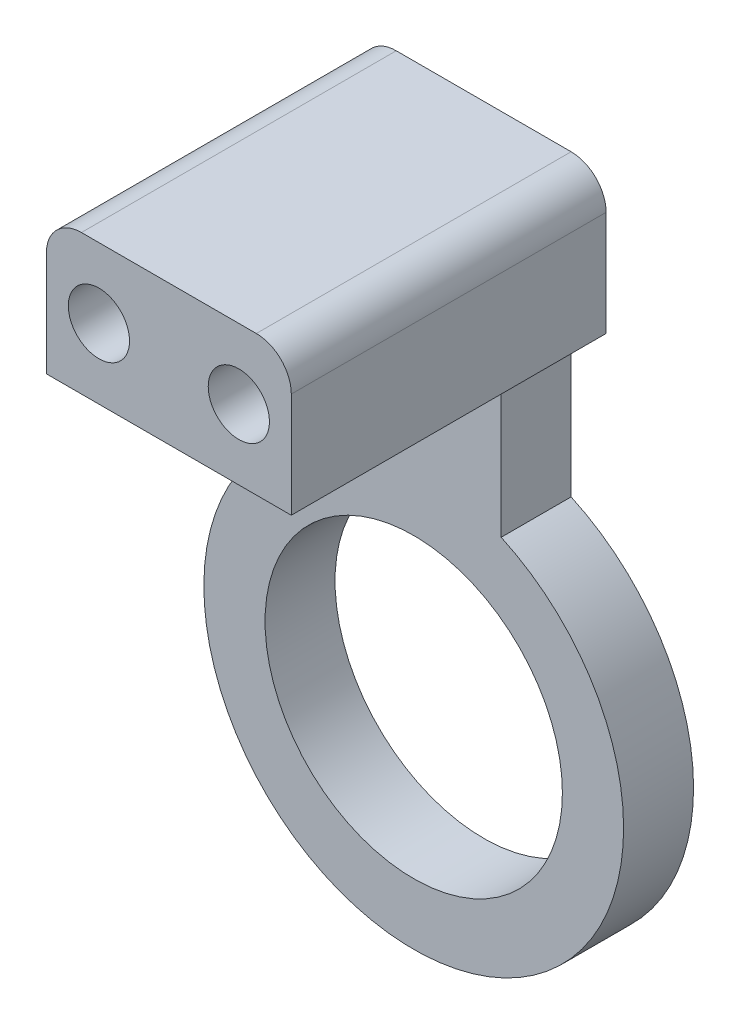
ISO-10303-21;
HEADER;
FILE_DESCRIPTION(('STEP AP214'),'2;1');
FILE_NAME('part.step','',(''),(''),'','','');
FILE_SCHEMA(('AUTOMOTIVE_DESIGN { 1 0 10303 214 1 1 1 1 }'));
ENDSEC;
DATA;
#1=APPLICATION_CONTEXT('core data for automotive mechanical design processes');
#2=APPLICATION_PROTOCOL_DEFINITION('international standard','automotive_design',2000,#1);
#3=PRODUCT_CONTEXT('',#1,'mechanical');
#4=PRODUCT('Part','Part','',(#3));
#5=PRODUCT_RELATED_PRODUCT_CATEGORY('part','',(#4));
#6=PRODUCT_DEFINITION_FORMATION('','',#4);
#7=PRODUCT_DEFINITION_CONTEXT('part definition',#1,'design');
#8=PRODUCT_DEFINITION('design','',#6,#7);
#9=PRODUCT_DEFINITION_SHAPE('','',#8);
#10=(LENGTH_UNIT() NAMED_UNIT(*) SI_UNIT(.MILLI.,.METRE.));
#11=(NAMED_UNIT(*) PLANE_ANGLE_UNIT() SI_UNIT($,.RADIAN.));
#12=(NAMED_UNIT(*) SI_UNIT($,.STERADIAN.) SOLID_ANGLE_UNIT());
#13=UNCERTAINTY_MEASURE_WITH_UNIT(LENGTH_MEASURE(1.E-05),#10,'distance_accuracy_value','');
#14=(GEOMETRIC_REPRESENTATION_CONTEXT(3) GLOBAL_UNCERTAINTY_ASSIGNED_CONTEXT((#13)) GLOBAL_UNIT_ASSIGNED_CONTEXT((#10,
#11,#12)) REPRESENTATION_CONTEXT('',''));
#15=CARTESIAN_POINT('',(0.,0.,0.));
#16=DIRECTION('',(0.,0.,1.));
#17=DIRECTION('',(1.,0.,0.));
#18=AXIS2_PLACEMENT_3D('',#15,#16,#17);
#19=CARTESIAN_POINT('',(-7.,0.,18.));
#20=DIRECTION('',(-1.,0.,0.));
#21=DIRECTION('',(0.,-1.,0.));
#22=AXIS2_PLACEMENT_3D('',#19,#20,#21);
#23=PLANE('',#22);
#24=DIRECTION('',(0.,1.,0.));
#25=VECTOR('',#24,1.);
#26=CARTESIAN_POINT('',(-7.,0.,18.));
#27=LINE('',#26,#25);
#28=CARTESIAN_POINT('',(-7.,-4.00000000000001,18.));
#29=VERTEX_POINT('',#28);
#30=CARTESIAN_POINT('',(-7.,1.99999999999999,18.));
#31=VERTEX_POINT('',#30);
#32=EDGE_CURVE('E165',#29,#31,#27,.T.);
#33=ORIENTED_EDGE('',*,*,#32,.T.);
#34=DIRECTION('',(0.,0.,-1.));
#35=VECTOR('',#34,1.);
#36=CARTESIAN_POINT('',(-7.,1.99999999999999,0.));
#37=LINE('',#36,#35);
#38=CARTESIAN_POINT('',(-7.,1.99999999999999,0.));
#39=VERTEX_POINT('',#38);
#40=EDGE_CURVE('E208',#31,#39,#37,.T.);
#41=ORIENTED_EDGE('',*,*,#40,.T.);
#42=DIRECTION('',(0.,1.,0.));
#43=VECTOR('',#42,1.);
#44=CARTESIAN_POINT('',(-7.,0.,0.));
#45=LINE('',#44,#43);
#46=CARTESIAN_POINT('',(-7.,-4.00000000000001,0.));
#47=VERTEX_POINT('',#46);
#48=EDGE_CURVE('E133',#47,#39,#45,.T.);
#49=ORIENTED_EDGE('',*,*,#48,.F.);
#50=DIRECTION('',(0.,0.,-1.));
#51=VECTOR('',#50,1.);
#52=CARTESIAN_POINT('',(-7.,-4.00000000000001,18.));
#53=LINE('',#52,#51);
#54=CARTESIAN_POINT('',(-7.,-4.00000000000001,4.));
#55=VERTEX_POINT('',#54);
#56=EDGE_CURVE('E185',#55,#47,#53,.T.);
#57=ORIENTED_EDGE('',*,*,#56,.F.);
#58=EDGE_CURVE('E186',#29,#55,#53,.T.);
#59=ORIENTED_EDGE('',*,*,#58,.F.);
#60=EDGE_LOOP('',(#33,#41,#49,#57,#59));
#61=FACE_BOUND('',#60,.T.);
#62=ADVANCED_FACE('F36',(#61),#23,.T.);
#63=CARTESIAN_POINT('',(0.,-4.00000000000001,18.));
#64=DIRECTION('',(0.,-1.,0.));
#65=DIRECTION('',(1.,0.,0.));
#66=AXIS2_PLACEMENT_3D('',#63,#64,#65);
#67=PLANE('',#66);
#68=ORIENTED_EDGE('',*,*,#58,.T.);
#69=DIRECTION('',(-1.,0.,0.));
#70=VECTOR('',#69,1.);
#71=CARTESIAN_POINT('',(0.,-4.00000000000001,4.));
#72=LINE('',#71,#70);
#73=CARTESIAN_POINT('',(7.,-4.00000000000001,4.));
#74=VERTEX_POINT('',#73);
#75=EDGE_CURVE('E156',#74,#55,#72,.T.);
#76=ORIENTED_EDGE('',*,*,#75,.F.);
#77=DIRECTION('',(0.,0.,-1.));
#78=VECTOR('',#77,1.);
#79=CARTESIAN_POINT('',(7.,-4.00000000000001,18.));
#80=LINE('',#79,#78);
#81=CARTESIAN_POINT('',(7.,-4.00000000000001,18.));
#82=VERTEX_POINT('',#81);
#83=EDGE_CURVE('E182',#82,#74,#80,.T.);
#84=ORIENTED_EDGE('',*,*,#83,.F.);
#85=DIRECTION('',(-1.,0.,0.));
#86=VECTOR('',#85,1.);
#87=CARTESIAN_POINT('',(0.,-4.00000000000001,18.));
#88=LINE('',#87,#86);
#89=EDGE_CURVE('E168',#82,#29,#88,.T.);
#90=ORIENTED_EDGE('',*,*,#89,.T.);
#91=EDGE_LOOP('',(#68,#76,#84,#90));
#92=FACE_BOUND('',#91,.T.);
#93=ADVANCED_FACE('F265',(#92),#67,.T.);
#94=CARTESIAN_POINT('',(7.,0.,18.));
#95=DIRECTION('',(-1.,0.,0.));
#96=DIRECTION('',(0.,-1.,0.));
#97=AXIS2_PLACEMENT_3D('',#94,#95,#96);
#98=PLANE('',#97);
#99=DIRECTION('',(0.,1.,0.));
#100=VECTOR('',#99,1.);
#101=CARTESIAN_POINT('',(7.,0.,0.));
#102=LINE('',#101,#100);
#103=CARTESIAN_POINT('',(7.,-4.00000000000001,0.));
#104=VERTEX_POINT('',#103);
#105=CARTESIAN_POINT('',(7.,2.,0.));
#106=VERTEX_POINT('',#105);
#107=EDGE_CURVE('E179',#104,#106,#102,.T.);
#108=ORIENTED_EDGE('',*,*,#107,.T.);
#109=DIRECTION('',(0.,0.,-1.));
#110=VECTOR('',#109,1.);
#111=CARTESIAN_POINT('',(7.,2.,18.));
#112=LINE('',#111,#110);
#113=CARTESIAN_POINT('',(7.,2.,18.));
#114=VERTEX_POINT('',#113);
#115=EDGE_CURVE('E11',#106,#114,#112,.F.);
#116=ORIENTED_EDGE('',*,*,#115,.T.);
#117=DIRECTION('',(0.,1.,0.));
#118=VECTOR('',#117,1.);
#119=CARTESIAN_POINT('',(7.,0.,18.));
#120=LINE('',#119,#118);
#121=EDGE_CURVE('E172',#82,#114,#120,.T.);
#122=ORIENTED_EDGE('',*,*,#121,.F.);
#123=ORIENTED_EDGE('',*,*,#83,.T.);
#124=EDGE_CURVE('E176',#74,#104,#80,.T.);
#125=ORIENTED_EDGE('',*,*,#124,.T.);
#126=EDGE_LOOP('',(#108,#116,#122,#123,#125));
#127=FACE_BOUND('',#126,.T.);
#128=ADVANCED_FACE('F241',(#127),#98,.F.);
#129=CARTESIAN_POINT('',(0.,3.99999999999999,18.));
#130=DIRECTION('',(0.,-1.,0.));
#131=DIRECTION('',(1.,0.,0.));
#132=AXIS2_PLACEMENT_3D('',#129,#130,#131);
#133=PLANE('',#132);
#134=DIRECTION('',(-1.,0.,0.));
#135=VECTOR('',#134,1.);
#136=CARTESIAN_POINT('',(0.,3.99999999999999,0.));
#137=LINE('',#136,#135);
#138=CARTESIAN_POINT('',(5.,4.,0.));
#139=VERTEX_POINT('',#138);
#140=CARTESIAN_POINT('',(-5.,3.99999999999999,0.));
#141=VERTEX_POINT('',#140);
#142=EDGE_CURVE('E169',#139,#141,#137,.T.);
#143=ORIENTED_EDGE('',*,*,#142,.T.);
#144=DIRECTION('',(0.,0.,-1.));
#145=VECTOR('',#144,1.);
#146=CARTESIAN_POINT('',(-5.,3.99999999999999,18.));
#147=LINE('',#146,#145);
#148=CARTESIAN_POINT('',(-5.,3.99999999999999,18.));
#149=VERTEX_POINT('',#148);
#150=EDGE_CURVE('E57',#141,#149,#147,.F.);
#151=ORIENTED_EDGE('',*,*,#150,.T.);
#152=DIRECTION('',(-1.,0.,0.));
#153=VECTOR('',#152,1.);
#154=CARTESIAN_POINT('',(0.,3.99999999999999,18.));
#155=LINE('',#154,#153);
#156=CARTESIAN_POINT('',(5.,4.,18.));
#157=VERTEX_POINT('',#156);
#158=EDGE_CURVE('E174',#157,#149,#155,.T.);
#159=ORIENTED_EDGE('',*,*,#158,.F.);
#160=DIRECTION('',(0.,0.,-1.));
#161=VECTOR('',#160,1.);
#162=CARTESIAN_POINT('',(5.,4.,18.));
#163=LINE('',#162,#161);
#164=EDGE_CURVE('E215',#157,#139,#163,.T.);
#165=ORIENTED_EDGE('',*,*,#164,.T.);
#166=EDGE_LOOP('',(#143,#151,#159,#165));
#167=FACE_BOUND('',#166,.T.);
#168=ADVANCED_FACE('F235',(#167),#133,.F.);
#169=CARTESIAN_POINT('',(0.,0.,18.));
#170=DIRECTION('',(0.,0.,1.));
#171=DIRECTION('',(1.,0.,0.));
#172=AXIS2_PLACEMENT_3D('',#169,#170,#171);
#173=PLANE('',#172);
#174=CARTESIAN_POINT('',(-4.,0.,18.));
#175=DIRECTION('',(0.,0.,-1.));
#176=DIRECTION('',(1.,0.,0.));
#177=AXIS2_PLACEMENT_3D('',#174,#175,#176);
#178=CIRCLE('',#177,1.75);
#179=CARTESIAN_POINT('',(-2.25,0.,18.));
#180=VERTEX_POINT('',#179);
#181=EDGE_CURVE('E303',#180,#180,#178,.T.);
#182=ORIENTED_EDGE('',*,*,#181,.T.);
#183=EDGE_LOOP('',(#182));
#184=FACE_BOUND('',#183,.T.);
#185=CARTESIAN_POINT('',(4.,0.,18.));
#186=DIRECTION('',(0.,0.,-1.));
#187=DIRECTION('',(-1.,0.,0.));
#188=AXIS2_PLACEMENT_3D('',#185,#186,#187);
#189=CIRCLE('',#188,1.75);
#190=CARTESIAN_POINT('',(2.25,0.,18.));
#191=VERTEX_POINT('',#190);
#192=EDGE_CURVE('E161',#191,#191,#189,.T.);
#193=ORIENTED_EDGE('',*,*,#192,.T.);
#194=EDGE_LOOP('',(#193));
#195=FACE_BOUND('',#194,.T.);
#196=ORIENTED_EDGE('',*,*,#158,.T.);
#197=CARTESIAN_POINT('',(-5.,1.99999999999999,18.));
#198=DIRECTION('',(0.,0.,1.));
#199=DIRECTION('',(1.,0.,0.));
#200=AXIS2_PLACEMENT_3D('',#197,#198,#199);
#201=CIRCLE('',#200,2.);
#202=EDGE_CURVE('E44',#149,#31,#201,.T.);
#203=ORIENTED_EDGE('',*,*,#202,.T.);
#204=ORIENTED_EDGE('',*,*,#32,.F.);
#205=ORIENTED_EDGE('',*,*,#89,.F.);
#206=ORIENTED_EDGE('',*,*,#121,.T.);
#207=CARTESIAN_POINT('',(5.,2.,18.));
#208=DIRECTION('',(0.,0.,1.));
#209=DIRECTION('',(1.,0.,0.));
#210=AXIS2_PLACEMENT_3D('',#207,#208,#209);
#211=CIRCLE('',#210,2.);
#212=EDGE_CURVE('E219',#114,#157,#211,.T.);
#213=ORIENTED_EDGE('',*,*,#212,.T.);
#214=EDGE_LOOP('',(#196,#203,#204,#205,#206,#213));
#215=FACE_BOUND('',#214,.T.);
#216=ADVANCED_FACE('F223',(#184,#195,#215),#173,.T.);
#217=CARTESIAN_POINT('',(0.,0.,0.));
#218=DIRECTION('',(0.,0.,1.));
#219=DIRECTION('',(1.,0.,0.));
#220=AXIS2_PLACEMENT_3D('',#217,#218,#219);
#221=PLANE('',#220);
#222=CARTESIAN_POINT('',(-4.,0.,0.));
#223=DIRECTION('',(0.,0.,-1.));
#224=DIRECTION('',(1.,0.,0.));
#225=AXIS2_PLACEMENT_3D('',#222,#223,#224);
#226=CIRCLE('',#225,1.75);
#227=CARTESIAN_POINT('',(-2.25,0.,0.));
#228=VERTEX_POINT('',#227);
#229=EDGE_CURVE('E306',#228,#228,#226,.T.);
#230=ORIENTED_EDGE('',*,*,#229,.F.);
#231=EDGE_LOOP('',(#230));
#232=FACE_BOUND('',#231,.T.);
#233=CARTESIAN_POINT('',(4.,0.,0.));
#234=DIRECTION('',(0.,0.,-1.));
#235=DIRECTION('',(-1.,0.,0.));
#236=AXIS2_PLACEMENT_3D('',#233,#234,#235);
#237=CIRCLE('',#236,1.75);
#238=CARTESIAN_POINT('',(2.25,0.,0.));
#239=VERTEX_POINT('',#238);
#240=EDGE_CURVE('E308',#239,#239,#237,.T.);
#241=ORIENTED_EDGE('',*,*,#240,.F.);
#242=EDGE_LOOP('',(#241));
#243=FACE_BOUND('',#242,.T.);
#244=ORIENTED_EDGE('',*,*,#48,.T.);
#245=CARTESIAN_POINT('',(-5.,1.99999999999999,0.));
#246=DIRECTION('',(0.,0.,1.));
#247=DIRECTION('',(1.,0.,0.));
#248=AXIS2_PLACEMENT_3D('',#245,#246,#247);
#249=CIRCLE('',#248,2.);
#250=EDGE_CURVE('E213',#39,#141,#249,.F.);
#251=ORIENTED_EDGE('',*,*,#250,.T.);
#252=ORIENTED_EDGE('',*,*,#142,.F.);
#253=CARTESIAN_POINT('',(5.,2.,0.));
#254=DIRECTION('',(0.,0.,1.));
#255=DIRECTION('',(1.,0.,0.));
#256=AXIS2_PLACEMENT_3D('',#253,#254,#255);
#257=CIRCLE('',#256,2.);
#258=EDGE_CURVE('E211',#139,#106,#257,.F.);
#259=ORIENTED_EDGE('',*,*,#258,.T.);
#260=ORIENTED_EDGE('',*,*,#107,.F.);
#261=CARTESIAN_POINT('',(7.00000000000001,-6.00000000000001,0.));
#262=DIRECTION('',(0.,0.,1.));
#263=DIRECTION('',(1.,0.,0.));
#264=AXIS2_PLACEMENT_3D('',#261,#262,#263);
#265=CIRCLE('',#264,2.);
#266=CARTESIAN_POINT('',(5.00000000000001,-6.00000000000001,0.));
#267=VERTEX_POINT('',#266);
#268=EDGE_CURVE('E203',#104,#267,#265,.T.);
#269=ORIENTED_EDGE('',*,*,#268,.T.);
#270=DIRECTION('',(0.,1.,0.));
#271=VECTOR('',#270,1.);
#272=CARTESIAN_POINT('',(5.00000000000001,0.,0.));
#273=LINE('',#272,#271);
#274=CARTESIAN_POINT('',(5.00000000000001,-13.0912878853643,0.));
#275=VERTEX_POINT('',#274);
#276=EDGE_CURVE('E151',#275,#267,#273,.T.);
#277=ORIENTED_EDGE('',*,*,#276,.F.);
#278=CARTESIAN_POINT('',(0.,-24.,0.));
#279=DIRECTION('',(0.,0.,1.));
#280=DIRECTION('',(1.,0.,0.));
#281=AXIS2_PLACEMENT_3D('',#278,#279,#280);
#282=CIRCLE('',#281,12.);
#283=CARTESIAN_POINT('',(-5.,-13.0912878853643,0.));
#284=VERTEX_POINT('',#283);
#285=EDGE_CURVE('E162',#284,#275,#282,.T.);
#286=ORIENTED_EDGE('',*,*,#285,.F.);
#287=DIRECTION('',(0.,1.,0.));
#288=VECTOR('',#287,1.);
#289=CARTESIAN_POINT('',(-5.,0.,0.));
#290=LINE('',#289,#288);
#291=CARTESIAN_POINT('',(-5.,-6.00000000000001,0.));
#292=VERTEX_POINT('',#291);
#293=EDGE_CURVE('E129',#284,#292,#290,.T.);
#294=ORIENTED_EDGE('',*,*,#293,.T.);
#295=CARTESIAN_POINT('',(-7.,-6.00000000000001,0.));
#296=DIRECTION('',(0.,0.,1.));
#297=DIRECTION('',(1.,0.,0.));
#298=AXIS2_PLACEMENT_3D('',#295,#296,#297);
#299=CIRCLE('',#298,2.);
#300=EDGE_CURVE('E200',#292,#47,#299,.T.);
#301=ORIENTED_EDGE('',*,*,#300,.T.);
#302=EDGE_LOOP('',(#244,#251,#252,#259,#260,#269,#277,#286,#294,#301));
#303=FACE_BOUND('',#302,.T.);
#304=CARTESIAN_POINT('',(0.,-24.,0.));
#305=DIRECTION('',(0.,0.,1.));
#306=DIRECTION('',(1.,0.,0.));
#307=AXIS2_PLACEMENT_3D('',#304,#305,#306);
#308=CIRCLE('',#307,8.5);
#309=CARTESIAN_POINT('',(8.50000000000005,-24.,0.));
#310=VERTEX_POINT('',#309);
#311=EDGE_CURVE('E158',#310,#310,#308,.T.);
#312=ORIENTED_EDGE('',*,*,#311,.T.);
#313=EDGE_LOOP('',(#312));
#314=FACE_BOUND('',#313,.T.);
#315=ADVANCED_FACE('F233',(#232,#243,#303,#314),#221,.F.);
#316=CARTESIAN_POINT('',(-5.,0.,4.));
#317=DIRECTION('',(-1.,0.,0.));
#318=DIRECTION('',(0.,-1.,0.));
#319=AXIS2_PLACEMENT_3D('',#316,#317,#318);
#320=PLANE('',#319);
#321=DIRECTION('',(0.,1.,0.));
#322=VECTOR('',#321,1.);
#323=CARTESIAN_POINT('',(-5.,0.,4.));
#324=LINE('',#323,#322);
#325=CARTESIAN_POINT('',(-5.,-13.0912878853643,4.));
#326=VERTEX_POINT('',#325);
#327=CARTESIAN_POINT('',(-5.,-6.00000000000001,4.));
#328=VERTEX_POINT('',#327);
#329=EDGE_CURVE('E126',#326,#328,#324,.T.);
#330=ORIENTED_EDGE('',*,*,#329,.T.);
#331=DIRECTION('',(0.,0.,-1.));
#332=VECTOR('',#331,1.);
#333=CARTESIAN_POINT('',(-5.,-6.00000000000001,0.));
#334=LINE('',#333,#332);
#335=EDGE_CURVE('E189',#328,#292,#334,.T.);
#336=ORIENTED_EDGE('',*,*,#335,.T.);
#337=ORIENTED_EDGE('',*,*,#293,.F.);
#338=DIRECTION('',(0.,0.,-1.));
#339=VECTOR('',#338,1.);
#340=CARTESIAN_POINT('',(-5.,-13.0912878853643,4.));
#341=LINE('',#340,#339);
#342=EDGE_CURVE('E121',#326,#284,#341,.T.);
#343=ORIENTED_EDGE('',*,*,#342,.F.);
#344=EDGE_LOOP('',(#330,#336,#337,#343));
#345=FACE_BOUND('',#344,.T.);
#346=ADVANCED_FACE('F123',(#345),#320,.T.);
#347=CARTESIAN_POINT('',(0.,-24.,4.));
#348=DIRECTION('',(0.,0.,-1.));
#349=DIRECTION('',(-1.,0.,0.));
#350=AXIS2_PLACEMENT_3D('',#347,#348,#349);
#351=CYLINDRICAL_SURFACE('',#350,12.);
#352=ORIENTED_EDGE('',*,*,#285,.T.);
#353=DIRECTION('',(0.,0.,-1.));
#354=VECTOR('',#353,1.);
#355=CARTESIAN_POINT('',(5.00000000000001,-13.0912878853643,4.));
#356=LINE('',#355,#354);
#357=CARTESIAN_POINT('',(5.00000000000001,-13.0912878853643,4.));
#358=VERTEX_POINT('',#357);
#359=EDGE_CURVE('E134',#358,#275,#356,.T.);
#360=ORIENTED_EDGE('',*,*,#359,.F.);
#361=CARTESIAN_POINT('',(0.,-24.,4.));
#362=DIRECTION('',(0.,0.,1.));
#363=DIRECTION('',(1.,0.,0.));
#364=AXIS2_PLACEMENT_3D('',#361,#362,#363);
#365=CIRCLE('',#364,12.);
#366=EDGE_CURVE('E138',#326,#358,#365,.T.);
#367=ORIENTED_EDGE('',*,*,#366,.F.);
#368=ORIENTED_EDGE('',*,*,#342,.T.);
#369=EDGE_LOOP('',(#352,#360,#367,#368));
#370=FACE_BOUND('',#369,.T.);
#371=ADVANCED_FACE('F139',(#370),#351,.T.);
#372=CARTESIAN_POINT('',(5.00000000000001,0.,4.));
#373=DIRECTION('',(-1.,0.,0.));
#374=DIRECTION('',(0.,-1.,0.));
#375=AXIS2_PLACEMENT_3D('',#372,#373,#374);
#376=PLANE('',#375);
#377=ORIENTED_EDGE('',*,*,#276,.T.);
#378=DIRECTION('',(0.,0.,-1.));
#379=VECTOR('',#378,1.);
#380=CARTESIAN_POINT('',(5.00000000000001,-6.00000000000001,4.));
#381=LINE('',#380,#379);
#382=CARTESIAN_POINT('',(5.00000000000001,-6.00000000000001,4.));
#383=VERTEX_POINT('',#382);
#384=EDGE_CURVE('E198',#267,#383,#381,.F.);
#385=ORIENTED_EDGE('',*,*,#384,.T.);
#386=DIRECTION('',(0.,1.,0.));
#387=VECTOR('',#386,1.);
#388=CARTESIAN_POINT('',(5.00000000000001,0.,4.));
#389=LINE('',#388,#387);
#390=EDGE_CURVE('E143',#358,#383,#389,.T.);
#391=ORIENTED_EDGE('',*,*,#390,.F.);
#392=ORIENTED_EDGE('',*,*,#359,.T.);
#393=EDGE_LOOP('',(#377,#385,#391,#392));
#394=FACE_BOUND('',#393,.T.);
#395=ADVANCED_FACE('F248',(#394),#376,.F.);
#396=CARTESIAN_POINT('',(0.,-24.,4.));
#397=DIRECTION('',(0.,0.,-1.));
#398=DIRECTION('',(-1.,0.,0.));
#399=AXIS2_PLACEMENT_3D('',#396,#397,#398);
#400=CYLINDRICAL_SURFACE('',#399,8.5);
#401=CARTESIAN_POINT('',(0.,-24.,4.));
#402=DIRECTION('',(0.,0.,1.));
#403=DIRECTION('',(1.,0.,0.));
#404=AXIS2_PLACEMENT_3D('',#401,#402,#403);
#405=CIRCLE('',#404,8.5);
#406=CARTESIAN_POINT('',(8.50000000000005,-24.,4.));
#407=VERTEX_POINT('',#406);
#408=EDGE_CURVE('E148',#407,#407,#405,.T.);
#409=ORIENTED_EDGE('',*,*,#408,.T.);
#410=EDGE_LOOP('',(#409));
#411=FACE_BOUND('',#410,.T.);
#412=ORIENTED_EDGE('',*,*,#311,.F.);
#413=EDGE_LOOP('',(#412));
#414=FACE_BOUND('',#413,.T.);
#415=ADVANCED_FACE('F260',(#411,#414),#400,.F.);
#416=CARTESIAN_POINT('',(0.,0.,4.));
#417=DIRECTION('',(0.,0.,1.));
#418=DIRECTION('',(1.,0.,0.));
#419=AXIS2_PLACEMENT_3D('',#416,#417,#418);
#420=PLANE('',#419);
#421=ORIENTED_EDGE('',*,*,#408,.F.);
#422=EDGE_LOOP('',(#421));
#423=FACE_BOUND('',#422,.T.);
#424=ORIENTED_EDGE('',*,*,#329,.F.);
#425=ORIENTED_EDGE('',*,*,#366,.T.);
#426=ORIENTED_EDGE('',*,*,#390,.T.);
#427=CARTESIAN_POINT('',(7.00000000000001,-6.00000000000001,4.));
#428=DIRECTION('',(0.,0.,1.));
#429=DIRECTION('',(1.,0.,0.));
#430=AXIS2_PLACEMENT_3D('',#427,#428,#429);
#431=CIRCLE('',#430,2.);
#432=EDGE_CURVE('E205',#383,#74,#431,.F.);
#433=ORIENTED_EDGE('',*,*,#432,.T.);
#434=ORIENTED_EDGE('',*,*,#75,.T.);
#435=CARTESIAN_POINT('',(-7.,-6.00000000000001,4.));
#436=DIRECTION('',(0.,0.,1.));
#437=DIRECTION('',(1.,0.,0.));
#438=AXIS2_PLACEMENT_3D('',#435,#436,#437);
#439=CIRCLE('',#438,2.);
#440=EDGE_CURVE('E147',#55,#328,#439,.F.);
#441=ORIENTED_EDGE('',*,*,#440,.T.);
#442=EDGE_LOOP('',(#424,#425,#426,#433,#434,#441));
#443=FACE_BOUND('',#442,.T.);
#444=ADVANCED_FACE('F145',(#423,#443),#420,.T.);
#445=CARTESIAN_POINT('',(-7.,-6.00000000000001,4.));
#446=DIRECTION('',(0.,0.,1.));
#447=DIRECTION('',(1.,0.,0.));
#448=AXIS2_PLACEMENT_3D('',#445,#446,#447);
#449=CYLINDRICAL_SURFACE('',#448,2.);
#450=ORIENTED_EDGE('',*,*,#440,.F.);
#451=ORIENTED_EDGE('',*,*,#56,.T.);
#452=ORIENTED_EDGE('',*,*,#300,.F.);
#453=ORIENTED_EDGE('',*,*,#335,.F.);
#454=EDGE_LOOP('',(#450,#451,#452,#453));
#455=FACE_BOUND('',#454,.T.);
#456=ADVANCED_FACE('F251',(#455),#449,.F.);
#457=CARTESIAN_POINT('',(7.00000000000001,-6.00000000000001,18.));
#458=DIRECTION('',(0.,0.,-1.));
#459=DIRECTION('',(-1.,0.,0.));
#460=AXIS2_PLACEMENT_3D('',#457,#458,#459);
#461=CYLINDRICAL_SURFACE('',#460,2.);
#462=ORIENTED_EDGE('',*,*,#432,.F.);
#463=ORIENTED_EDGE('',*,*,#384,.F.);
#464=ORIENTED_EDGE('',*,*,#268,.F.);
#465=ORIENTED_EDGE('',*,*,#124,.F.);
#466=EDGE_LOOP('',(#462,#463,#464,#465));
#467=FACE_BOUND('',#466,.T.);
#468=ADVANCED_FACE('F245',(#467),#461,.F.);
#469=CARTESIAN_POINT('',(4.,0.,18.));
#470=DIRECTION('',(0.,0.,-1.));
#471=DIRECTION('',(-1.,0.,0.));
#472=AXIS2_PLACEMENT_3D('',#469,#470,#471);
#473=CYLINDRICAL_SURFACE('',#472,1.75);
#474=ORIENTED_EDGE('',*,*,#192,.F.);
#475=EDGE_LOOP('',(#474));
#476=FACE_BOUND('',#475,.T.);
#477=ORIENTED_EDGE('',*,*,#240,.T.);
#478=EDGE_LOOP('',(#477));
#479=FACE_BOUND('',#478,.T.);
#480=ADVANCED_FACE('F258',(#476,#479),#473,.F.);
#481=CARTESIAN_POINT('',(-4.,0.,18.));
#482=DIRECTION('',(0.,0.,-1.));
#483=DIRECTION('',(-1.,0.,0.));
#484=AXIS2_PLACEMENT_3D('',#481,#482,#483);
#485=CYLINDRICAL_SURFACE('',#484,1.75);
#486=ORIENTED_EDGE('',*,*,#181,.F.);
#487=EDGE_LOOP('',(#486));
#488=FACE_BOUND('',#487,.T.);
#489=ORIENTED_EDGE('',*,*,#229,.T.);
#490=EDGE_LOOP('',(#489));
#491=FACE_BOUND('',#490,.T.);
#492=ADVANCED_FACE('F293',(#488,#491),#485,.F.);
#493=CARTESIAN_POINT('',(-5.,1.99999999999999,18.));
#494=DIRECTION('',(0.,0.,1.));
#495=DIRECTION('',(1.,0.,0.));
#496=AXIS2_PLACEMENT_3D('',#493,#494,#495);
#497=CYLINDRICAL_SURFACE('',#496,2.);
#498=ORIENTED_EDGE('',*,*,#202,.F.);
#499=ORIENTED_EDGE('',*,*,#150,.F.);
#500=ORIENTED_EDGE('',*,*,#250,.F.);
#501=ORIENTED_EDGE('',*,*,#40,.F.);
#502=EDGE_LOOP('',(#498,#499,#500,#501));
#503=FACE_BOUND('',#502,.T.);
#504=ADVANCED_FACE('F230',(#503),#497,.T.);
#505=CARTESIAN_POINT('',(5.,2.,18.));
#506=DIRECTION('',(0.,0.,-1.));
#507=DIRECTION('',(-1.,0.,0.));
#508=AXIS2_PLACEMENT_3D('',#505,#506,#507);
#509=CYLINDRICAL_SURFACE('',#508,2.);
#510=ORIENTED_EDGE('',*,*,#212,.F.);
#511=ORIENTED_EDGE('',*,*,#115,.F.);
#512=ORIENTED_EDGE('',*,*,#258,.F.);
#513=ORIENTED_EDGE('',*,*,#164,.F.);
#514=EDGE_LOOP('',(#510,#511,#512,#513));
#515=FACE_BOUND('',#514,.T.);
#516=ADVANCED_FACE('F38',(#515),#509,.T.);
#517=CLOSED_SHELL('',(#62,#93,#128,#168,#216,#315,#346,#371,#395,#415,#444,#456,#468,#480,#492,
#504,#516));
#518=MANIFOLD_SOLID_BREP('B2',#517);
#519=ADVANCED_BREP_SHAPE_REPRESENTATION('',(#18,#518),#14);
#520=SHAPE_DEFINITION_REPRESENTATION(#9,#519);
ENDSEC;
END-ISO-10303-21;
